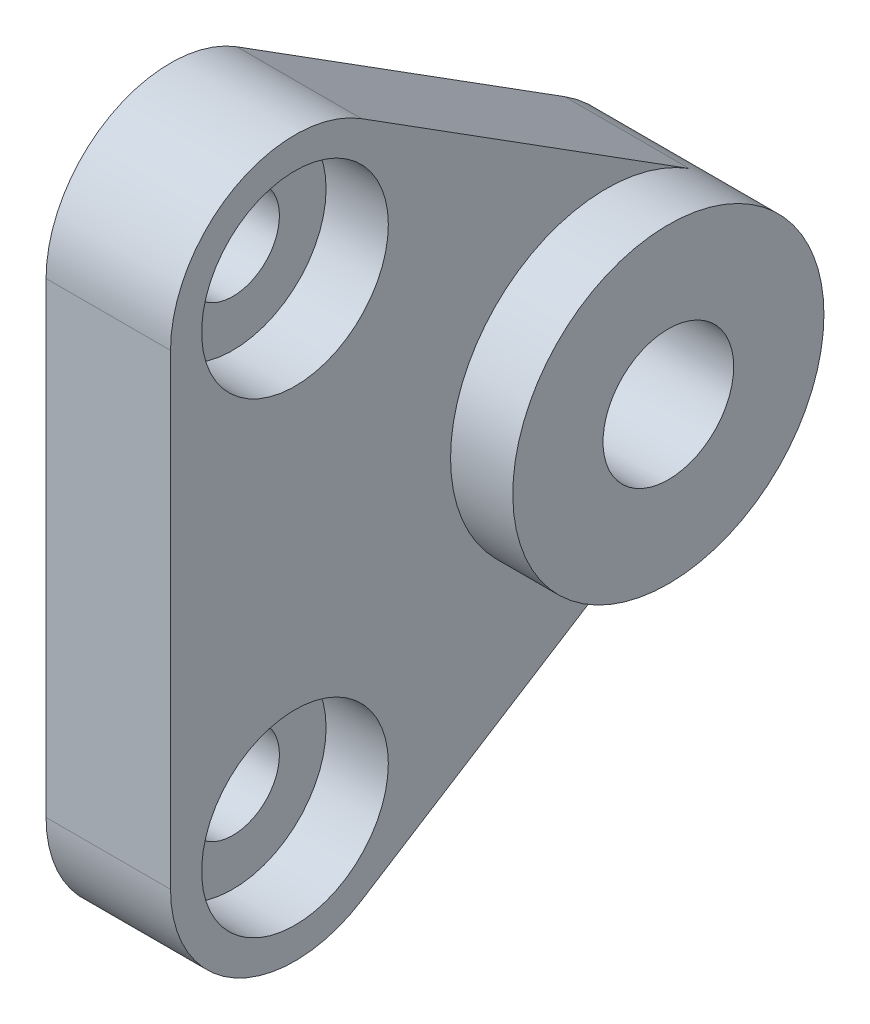
ISO-10303-21;
HEADER;
FILE_DESCRIPTION(('STEP AP214'),'2;1');
FILE_NAME('part.step','',(''),(''),'','','');
FILE_SCHEMA(('AUTOMOTIVE_DESIGN { 1 0 10303 214 1 1 1 1 }'));
ENDSEC;
DATA;
#1=APPLICATION_CONTEXT('core data for automotive mechanical design processes');
#2=APPLICATION_PROTOCOL_DEFINITION('international standard','automotive_design',2000,#1);
#3=PRODUCT_CONTEXT('',#1,'mechanical');
#4=PRODUCT('Part','Part','',(#3));
#5=PRODUCT_RELATED_PRODUCT_CATEGORY('part','',(#4));
#6=PRODUCT_DEFINITION_FORMATION('','',#4);
#7=PRODUCT_DEFINITION_CONTEXT('part definition',#1,'design');
#8=PRODUCT_DEFINITION('design','',#6,#7);
#9=PRODUCT_DEFINITION_SHAPE('','',#8);
#10=(LENGTH_UNIT() NAMED_UNIT(*) SI_UNIT(.MILLI.,.METRE.));
#11=(NAMED_UNIT(*) PLANE_ANGLE_UNIT() SI_UNIT($,.RADIAN.));
#12=(NAMED_UNIT(*) SI_UNIT($,.STERADIAN.) SOLID_ANGLE_UNIT());
#13=UNCERTAINTY_MEASURE_WITH_UNIT(LENGTH_MEASURE(1.E-05),#10,'distance_accuracy_value','');
#14=(GEOMETRIC_REPRESENTATION_CONTEXT(3) GLOBAL_UNCERTAINTY_ASSIGNED_CONTEXT((#13)) GLOBAL_UNIT_ASSIGNED_CONTEXT((#10,
#11,#12)) REPRESENTATION_CONTEXT('',''));
#15=CARTESIAN_POINT('',(0.,0.,0.));
#16=DIRECTION('',(0.,0.,1.));
#17=DIRECTION('',(1.,0.,0.));
#18=AXIS2_PLACEMENT_3D('',#15,#16,#17);
#19=CARTESIAN_POINT('',(6.,14.1031712461703,-8.90922459836754));
#20=DIRECTION('',(0.,0.845435890840135,-0.534076918130101));
#21=DIRECTION('',(0.,0.534076918130101,0.845435890840136));
#22=AXIS2_PLACEMENT_3D('',#19,#20,#21);
#23=PLANE('',#22);
#24=DIRECTION('',(-1.,0.,0.));
#25=VECTOR('',#24,1.);
#26=CARTESIAN_POINT('',(6.,18.3817435633605,-2.1363076725204));
#27=LINE('',#26,#25);
#28=CARTESIAN_POINT('',(4.,18.3817435633605,-2.1363076725204));
#29=VERTEX_POINT('',#28);
#30=CARTESIAN_POINT('',(0.,18.3817435633605,-2.1363076725204));
#31=VERTEX_POINT('',#30);
#32=EDGE_CURVE('E11',#29,#31,#27,.T.);
#33=ORIENTED_EDGE('',*,*,#32,.F.);
#34=DIRECTION('',(0.,0.534076918130101,0.845435890840136));
#35=VECTOR('',#34,1.);
#36=CARTESIAN_POINT('',(4.,14.1031712461703,-8.90922459836754));
#37=LINE('',#36,#35);
#38=CARTESIAN_POINT('',(4.,11.7271794542007,-12.6703845906505));
#39=VERTEX_POINT('',#38);
#40=EDGE_CURVE('E103',#39,#29,#37,.T.);
#41=ORIENTED_EDGE('',*,*,#40,.F.);
#42=DIRECTION('',(-1.,0.,0.));
#43=VECTOR('',#42,1.);
#44=CARTESIAN_POINT('',(6.,11.7271794542007,-12.6703845906505));
#45=LINE('',#44,#43);
#46=CARTESIAN_POINT('',(0.,11.7271794542007,-12.6703845906505));
#47=VERTEX_POINT('',#46);
#48=EDGE_CURVE('E62',#39,#47,#45,.T.);
#49=ORIENTED_EDGE('',*,*,#48,.T.);
#50=DIRECTION('',(0.,-0.534076918130101,-0.845435890840136));
#51=VECTOR('',#50,1.);
#52=CARTESIAN_POINT('',(0.,14.1031712461703,-8.90922459836754));
#53=LINE('',#52,#51);
#54=EDGE_CURVE('E135',#31,#47,#53,.T.);
#55=ORIENTED_EDGE('',*,*,#54,.F.);
#56=EDGE_LOOP('',(#33,#41,#49,#55));
#57=FACE_BOUND('',#56,.T.);
#58=ADVANCED_FACE('F46',(#57),#23,.T.);
#59=CARTESIAN_POINT('',(6.,15.,0.));
#60=DIRECTION('',(-1.,0.,0.));
#61=DIRECTION('',(0.,0.,1.));
#62=AXIS2_PLACEMENT_3D('',#59,#60,#61);
#63=CYLINDRICAL_SURFACE('',#62,4.);
#64=CARTESIAN_POINT('',(4.,15.,0.));
#65=DIRECTION('',(1.,0.,0.));
#66=DIRECTION('',(0.,0.,-1.));
#67=AXIS2_PLACEMENT_3D('',#64,#65,#66);
#68=CIRCLE('',#67,4.);
#69=CARTESIAN_POINT('',(4.,15.,4.));
#70=VERTEX_POINT('',#69);
#71=EDGE_CURVE('E109',#29,#70,#68,.T.);
#72=ORIENTED_EDGE('',*,*,#71,.F.);
#73=ORIENTED_EDGE('',*,*,#32,.T.);
#74=CARTESIAN_POINT('',(0.,15.,0.));
#75=DIRECTION('',(1.,0.,0.));
#76=DIRECTION('',(0.,0.,-1.));
#77=AXIS2_PLACEMENT_3D('',#74,#75,#76);
#78=CIRCLE('',#77,4.);
#79=CARTESIAN_POINT('',(0.,15.,4.));
#80=VERTEX_POINT('',#79);
#81=EDGE_CURVE('E150',#31,#80,#78,.T.);
#82=ORIENTED_EDGE('',*,*,#81,.T.);
#83=DIRECTION('',(-1.,0.,0.));
#84=VECTOR('',#83,1.);
#85=CARTESIAN_POINT('',(6.,15.,4.));
#86=LINE('',#85,#84);
#87=EDGE_CURVE('E54',#70,#80,#86,.T.);
#88=ORIENTED_EDGE('',*,*,#87,.F.);
#89=EDGE_LOOP('',(#72,#73,#82,#88));
#90=FACE_BOUND('',#89,.T.);
#91=ADVANCED_FACE('F189',(#90),#63,.T.);
#92=CARTESIAN_POINT('',(6.,0.,4.));
#93=DIRECTION('',(0.,0.,1.));
#94=DIRECTION('',(1.,0.,0.));
#95=AXIS2_PLACEMENT_3D('',#92,#93,#94);
#96=PLANE('',#95);
#97=DIRECTION('',(-1.,0.,0.));
#98=VECTOR('',#97,1.);
#99=CARTESIAN_POINT('',(6.,0.,4.));
#100=LINE('',#99,#98);
#101=CARTESIAN_POINT('',(4.,0.,4.));
#102=VERTEX_POINT('',#101);
#103=CARTESIAN_POINT('',(0.,0.,4.));
#104=VERTEX_POINT('',#103);
#105=EDGE_CURVE('E127',#102,#104,#100,.T.);
#106=ORIENTED_EDGE('',*,*,#105,.F.);
#107=DIRECTION('',(0.,-1.,0.));
#108=VECTOR('',#107,1.);
#109=CARTESIAN_POINT('',(4.,0.,4.));
#110=LINE('',#109,#108);
#111=EDGE_CURVE('E241',#70,#102,#110,.T.);
#112=ORIENTED_EDGE('',*,*,#111,.F.);
#113=ORIENTED_EDGE('',*,*,#87,.T.);
#114=DIRECTION('',(0.,1.,0.));
#115=VECTOR('',#114,1.);
#116=CARTESIAN_POINT('',(0.,0.,4.));
#117=LINE('',#116,#115);
#118=EDGE_CURVE('E153',#104,#80,#117,.T.);
#119=ORIENTED_EDGE('',*,*,#118,.F.);
#120=EDGE_LOOP('',(#106,#112,#113,#119));
#121=FACE_BOUND('',#120,.T.);
#122=ADVANCED_FACE('F193',(#121),#96,.T.);
#123=CARTESIAN_POINT('',(6.,0.,0.));
#124=DIRECTION('',(-1.,0.,0.));
#125=DIRECTION('',(0.,0.,1.));
#126=AXIS2_PLACEMENT_3D('',#123,#124,#125);
#127=CYLINDRICAL_SURFACE('',#126,4.);
#128=CARTESIAN_POINT('',(4.,0.,0.));
#129=DIRECTION('',(1.,0.,0.));
#130=DIRECTION('',(0.,0.,-1.));
#131=AXIS2_PLACEMENT_3D('',#128,#129,#130);
#132=CIRCLE('',#131,4.);
#133=CARTESIAN_POINT('',(4.,-3.38174356336054,-2.13630767252041));
#134=VERTEX_POINT('',#133);
#135=EDGE_CURVE('E237',#102,#134,#132,.T.);
#136=ORIENTED_EDGE('',*,*,#135,.F.);
#137=ORIENTED_EDGE('',*,*,#105,.T.);
#138=CARTESIAN_POINT('',(0.,0.,0.));
#139=DIRECTION('',(1.,0.,0.));
#140=DIRECTION('',(0.,0.,-1.));
#141=AXIS2_PLACEMENT_3D('',#138,#139,#140);
#142=CIRCLE('',#141,4.);
#143=CARTESIAN_POINT('',(0.,-3.38174356336054,-2.13630767252041));
#144=VERTEX_POINT('',#143);
#145=EDGE_CURVE('E156',#104,#144,#142,.T.);
#146=ORIENTED_EDGE('',*,*,#145,.T.);
#147=DIRECTION('',(-1.,0.,0.));
#148=VECTOR('',#147,1.);
#149=CARTESIAN_POINT('',(6.,-3.38174356336054,-2.13630767252041));
#150=LINE('',#149,#148);
#151=EDGE_CURVE('E117',#134,#144,#150,.T.);
#152=ORIENTED_EDGE('',*,*,#151,.F.);
#153=EDGE_LOOP('',(#136,#137,#146,#152));
#154=FACE_BOUND('',#153,.T.);
#155=ADVANCED_FACE('F198',(#154),#127,.T.);
#156=CARTESIAN_POINT('',(6.,-3.38174356336054,-2.13630767252041));
#157=DIRECTION('',(0.,-0.845435890840135,-0.534076918130101));
#158=DIRECTION('',(0.,0.534076918130101,-0.845435890840135));
#159=AXIS2_PLACEMENT_3D('',#156,#157,#158);
#160=PLANE('',#159);
#161=DIRECTION('',(-1.,0.,0.));
#162=VECTOR('',#161,1.);
#163=CARTESIAN_POINT('',(6.,3.27282054579932,-12.6703845906505));
#164=LINE('',#163,#162);
#165=CARTESIAN_POINT('',(4.,3.27282054579932,-12.6703845906505));
#166=VERTEX_POINT('',#165);
#167=CARTESIAN_POINT('',(0.,3.27282054579932,-12.6703845906505));
#168=VERTEX_POINT('',#167);
#169=EDGE_CURVE('E69',#166,#168,#164,.T.);
#170=ORIENTED_EDGE('',*,*,#169,.F.);
#171=DIRECTION('',(0.,0.534076918130101,-0.845435890840135));
#172=VECTOR('',#171,1.);
#173=CARTESIAN_POINT('',(4.,-3.38174356336054,-2.13630767252041));
#174=LINE('',#173,#172);
#175=EDGE_CURVE('E106',#134,#166,#174,.T.);
#176=ORIENTED_EDGE('',*,*,#175,.F.);
#177=ORIENTED_EDGE('',*,*,#151,.T.);
#178=DIRECTION('',(0.,-0.534076918130101,0.845435890840135));
#179=VECTOR('',#178,1.);
#180=CARTESIAN_POINT('',(0.,-3.38174356336054,-2.13630767252041));
#181=LINE('',#180,#179);
#182=EDGE_CURVE('E159',#168,#144,#181,.T.);
#183=ORIENTED_EDGE('',*,*,#182,.F.);
#184=EDGE_LOOP('',(#170,#176,#177,#183));
#185=FACE_BOUND('',#184,.T.);
#186=ADVANCED_FACE('F204',(#185),#160,.T.);
#187=CARTESIAN_POINT('',(6.,0.,0.));
#188=DIRECTION('',(1.,0.,0.));
#189=DIRECTION('',(0.,0.,-1.));
#190=AXIS2_PLACEMENT_3D('',#187,#188,#189);
#191=PLANE('',#190);
#192=CARTESIAN_POINT('',(6.,7.5,-10.));
#193=DIRECTION('',(1.,0.,0.));
#194=DIRECTION('',(0.,0.,-1.));
#195=AXIS2_PLACEMENT_3D('',#192,#193,#194);
#196=CIRCLE('',#195,2.1);
#197=CARTESIAN_POINT('',(6.,7.5,-12.1));
#198=VERTEX_POINT('',#197);
#199=EDGE_CURVE('E115',#198,#198,#196,.T.);
#200=ORIENTED_EDGE('',*,*,#199,.F.);
#201=EDGE_LOOP('',(#200));
#202=FACE_BOUND('',#201,.T.);
#203=CARTESIAN_POINT('',(6.,7.5,-10.));
#204=DIRECTION('',(1.,0.,0.));
#205=DIRECTION('',(0.,0.,-1.));
#206=AXIS2_PLACEMENT_3D('',#203,#204,#205);
#207=CIRCLE('',#206,5.00000000000001);
#208=CARTESIAN_POINT('',(6.,7.5,-15.));
#209=VERTEX_POINT('',#208);
#210=EDGE_CURVE('E120',#209,#209,#207,.T.);
#211=ORIENTED_EDGE('',*,*,#210,.T.);
#212=EDGE_LOOP('',(#211));
#213=FACE_BOUND('',#212,.T.);
#214=ADVANCED_FACE('F207',(#202,#213),#191,.T.);
#215=CARTESIAN_POINT('',(3.,0.,0.));
#216=DIRECTION('',(1.,0.,0.));
#217=DIRECTION('',(0.,0.,-1.));
#218=AXIS2_PLACEMENT_3D('',#215,#216,#217);
#219=CYLINDRICAL_SURFACE('',#218,3.);
#220=CARTESIAN_POINT('',(2.,0.,0.));
#221=DIRECTION('',(1.,0.,0.));
#222=DIRECTION('',(0.,0.,-1.));
#223=AXIS2_PLACEMENT_3D('',#220,#221,#222);
#224=CIRCLE('',#223,3.);
#225=CARTESIAN_POINT('',(2.,0.,-3.));
#226=VERTEX_POINT('',#225);
#227=EDGE_CURVE('E131',#226,#226,#224,.T.);
#228=ORIENTED_EDGE('',*,*,#227,.F.);
#229=EDGE_LOOP('',(#228));
#230=FACE_BOUND('',#229,.T.);
#231=CARTESIAN_POINT('',(4.,0.,0.));
#232=DIRECTION('',(1.,0.,0.));
#233=DIRECTION('',(0.,0.,-1.));
#234=AXIS2_PLACEMENT_3D('',#231,#232,#233);
#235=CIRCLE('',#234,3.);
#236=CARTESIAN_POINT('',(4.,0.,-3.));
#237=VERTEX_POINT('',#236);
#238=EDGE_CURVE('E234',#237,#237,#235,.F.);
#239=ORIENTED_EDGE('',*,*,#238,.F.);
#240=EDGE_LOOP('',(#239));
#241=FACE_BOUND('',#240,.T.);
#242=ADVANCED_FACE('F219',(#230,#241),#219,.F.);
#243=CARTESIAN_POINT('',(3.,15.,0.));
#244=DIRECTION('',(1.,0.,0.));
#245=DIRECTION('',(0.,0.,-1.));
#246=AXIS2_PLACEMENT_3D('',#243,#244,#245);
#247=CYLINDRICAL_SURFACE('',#246,3.);
#248=CARTESIAN_POINT('',(2.,15.,0.));
#249=DIRECTION('',(1.,0.,0.));
#250=DIRECTION('',(0.,0.,-1.));
#251=AXIS2_PLACEMENT_3D('',#248,#249,#250);
#252=CIRCLE('',#251,3.);
#253=CARTESIAN_POINT('',(2.,15.,-3.));
#254=VERTEX_POINT('',#253);
#255=EDGE_CURVE('E137',#254,#254,#252,.T.);
#256=ORIENTED_EDGE('',*,*,#255,.F.);
#257=EDGE_LOOP('',(#256));
#258=FACE_BOUND('',#257,.T.);
#259=CARTESIAN_POINT('',(4.,15.,0.));
#260=DIRECTION('',(1.,0.,0.));
#261=DIRECTION('',(0.,0.,-1.));
#262=AXIS2_PLACEMENT_3D('',#259,#260,#261);
#263=CIRCLE('',#262,3.);
#264=CARTESIAN_POINT('',(4.,15.,-3.));
#265=VERTEX_POINT('',#264);
#266=EDGE_CURVE('E142',#265,#265,#263,.F.);
#267=ORIENTED_EDGE('',*,*,#266,.F.);
#268=EDGE_LOOP('',(#267));
#269=FACE_BOUND('',#268,.T.);
#270=ADVANCED_FACE('F214',(#258,#269),#247,.F.);
#271=CARTESIAN_POINT('',(6.,15.,0.));
#272=DIRECTION('',(-1.,0.,0.));
#273=DIRECTION('',(0.,0.,1.));
#274=AXIS2_PLACEMENT_3D('',#271,#272,#273);
#275=CYLINDRICAL_SURFACE('',#274,1.5);
#276=CARTESIAN_POINT('',(0.,15.,0.));
#277=DIRECTION('',(1.,0.,0.));
#278=DIRECTION('',(0.,0.,-1.));
#279=AXIS2_PLACEMENT_3D('',#276,#277,#278);
#280=CIRCLE('',#279,1.5);
#281=CARTESIAN_POINT('',(0.,15.,-1.5));
#282=VERTEX_POINT('',#281);
#283=EDGE_CURVE('E165',#282,#282,#280,.T.);
#284=ORIENTED_EDGE('',*,*,#283,.F.);
#285=EDGE_LOOP('',(#284));
#286=FACE_BOUND('',#285,.T.);
#287=CARTESIAN_POINT('',(2.,15.,0.));
#288=DIRECTION('',(1.,0.,0.));
#289=DIRECTION('',(0.,0.,-1.));
#290=AXIS2_PLACEMENT_3D('',#287,#288,#289);
#291=CIRCLE('',#290,1.5);
#292=CARTESIAN_POINT('',(2.,15.,-1.5));
#293=VERTEX_POINT('',#292);
#294=EDGE_CURVE('E49',#293,#293,#291,.T.);
#295=ORIENTED_EDGE('',*,*,#294,.T.);
#296=EDGE_LOOP('',(#295));
#297=FACE_BOUND('',#296,.T.);
#298=ADVANCED_FACE('F211',(#286,#297),#275,.F.);
#299=CARTESIAN_POINT('',(6.,0.,0.));
#300=DIRECTION('',(-1.,0.,0.));
#301=DIRECTION('',(0.,0.,1.));
#302=AXIS2_PLACEMENT_3D('',#299,#300,#301);
#303=CYLINDRICAL_SURFACE('',#302,1.5);
#304=CARTESIAN_POINT('',(0.,0.,0.));
#305=DIRECTION('',(1.,0.,0.));
#306=DIRECTION('',(0.,0.,-1.));
#307=AXIS2_PLACEMENT_3D('',#304,#305,#306);
#308=CIRCLE('',#307,1.5);
#309=CARTESIAN_POINT('',(0.,0.,-1.5));
#310=VERTEX_POINT('',#309);
#311=EDGE_CURVE('E163',#310,#310,#308,.T.);
#312=ORIENTED_EDGE('',*,*,#311,.F.);
#313=EDGE_LOOP('',(#312));
#314=FACE_BOUND('',#313,.T.);
#315=CARTESIAN_POINT('',(2.,0.,0.));
#316=DIRECTION('',(1.,0.,0.));
#317=DIRECTION('',(0.,0.,-1.));
#318=AXIS2_PLACEMENT_3D('',#315,#316,#317);
#319=CIRCLE('',#318,1.5);
#320=CARTESIAN_POINT('',(2.,0.,-1.5));
#321=VERTEX_POINT('',#320);
#322=EDGE_CURVE('E129',#321,#321,#319,.T.);
#323=ORIENTED_EDGE('',*,*,#322,.T.);
#324=EDGE_LOOP('',(#323));
#325=FACE_BOUND('',#324,.T.);
#326=ADVANCED_FACE('F185',(#314,#325),#303,.F.);
#327=CARTESIAN_POINT('',(6.,7.5,-10.));
#328=DIRECTION('',(-1.,0.,0.));
#329=DIRECTION('',(0.,0.,1.));
#330=AXIS2_PLACEMENT_3D('',#327,#328,#329);
#331=CYLINDRICAL_SURFACE('',#330,5.00000000000001);
#332=CARTESIAN_POINT('',(4.,7.5,-10.));
#333=DIRECTION('',(1.,0.,0.));
#334=DIRECTION('',(0.,0.,-1.));
#335=AXIS2_PLACEMENT_3D('',#332,#333,#334);
#336=CIRCLE('',#335,5.);
#337=EDGE_CURVE('E100',#39,#166,#336,.T.);
#338=ORIENTED_EDGE('',*,*,#337,.T.);
#339=ORIENTED_EDGE('',*,*,#169,.T.);
#340=CARTESIAN_POINT('',(0.,7.5,-10.));
#341=DIRECTION('',(1.,0.,0.));
#342=DIRECTION('',(0.,0.,-1.));
#343=AXIS2_PLACEMENT_3D('',#340,#341,#342);
#344=CIRCLE('',#343,5.00000000000001);
#345=EDGE_CURVE('E113',#168,#47,#344,.T.);
#346=ORIENTED_EDGE('',*,*,#345,.T.);
#347=ORIENTED_EDGE('',*,*,#48,.F.);
#348=EDGE_LOOP('',(#338,#339,#346,#347));
#349=FACE_BOUND('',#348,.T.);
#350=ORIENTED_EDGE('',*,*,#210,.F.);
#351=EDGE_LOOP('',(#350));
#352=FACE_BOUND('',#351,.T.);
#353=ADVANCED_FACE('F111',(#349,#352),#331,.T.);
#354=CARTESIAN_POINT('',(6.,7.5,-10.));
#355=DIRECTION('',(-1.,0.,0.));
#356=DIRECTION('',(0.,0.,1.));
#357=AXIS2_PLACEMENT_3D('',#354,#355,#356);
#358=CYLINDRICAL_SURFACE('',#357,2.1);
#359=ORIENTED_EDGE('',*,*,#199,.T.);
#360=EDGE_LOOP('',(#359));
#361=FACE_BOUND('',#360,.T.);
#362=CARTESIAN_POINT('',(0.,7.5,-10.));
#363=DIRECTION('',(1.,0.,0.));
#364=DIRECTION('',(0.,0.,-1.));
#365=AXIS2_PLACEMENT_3D('',#362,#363,#364);
#366=CIRCLE('',#365,2.1);
#367=CARTESIAN_POINT('',(0.,7.5,-12.1));
#368=VERTEX_POINT('',#367);
#369=EDGE_CURVE('E123',#368,#368,#366,.T.);
#370=ORIENTED_EDGE('',*,*,#369,.F.);
#371=EDGE_LOOP('',(#370));
#372=FACE_BOUND('',#371,.T.);
#373=ADVANCED_FACE('F174',(#361,#372),#358,.F.);
#374=CARTESIAN_POINT('',(0.,0.,0.));
#375=DIRECTION('',(1.,0.,0.));
#376=DIRECTION('',(0.,0.,-1.));
#377=AXIS2_PLACEMENT_3D('',#374,#375,#376);
#378=PLANE('',#377);
#379=ORIENTED_EDGE('',*,*,#54,.T.);
#380=ORIENTED_EDGE('',*,*,#345,.F.);
#381=ORIENTED_EDGE('',*,*,#182,.T.);
#382=ORIENTED_EDGE('',*,*,#145,.F.);
#383=ORIENTED_EDGE('',*,*,#118,.T.);
#384=ORIENTED_EDGE('',*,*,#81,.F.);
#385=EDGE_LOOP('',(#379,#380,#381,#382,#383,#384));
#386=FACE_BOUND('',#385,.T.);
#387=ORIENTED_EDGE('',*,*,#311,.T.);
#388=EDGE_LOOP('',(#387));
#389=FACE_BOUND('',#388,.T.);
#390=ORIENTED_EDGE('',*,*,#283,.T.);
#391=EDGE_LOOP('',(#390));
#392=FACE_BOUND('',#391,.T.);
#393=ORIENTED_EDGE('',*,*,#369,.T.);
#394=EDGE_LOOP('',(#393));
#395=FACE_BOUND('',#394,.T.);
#396=ADVANCED_FACE('F172',(#386,#389,#392,#395),#378,.F.);
#397=CARTESIAN_POINT('',(2.,15.,0.));
#398=DIRECTION('',(1.,0.,0.));
#399=DIRECTION('',(0.,0.,-1.));
#400=AXIS2_PLACEMENT_3D('',#397,#398,#399);
#401=PLANE('',#400);
#402=ORIENTED_EDGE('',*,*,#294,.F.);
#403=EDGE_LOOP('',(#402));
#404=FACE_BOUND('',#403,.T.);
#405=ORIENTED_EDGE('',*,*,#255,.T.);
#406=EDGE_LOOP('',(#405));
#407=FACE_BOUND('',#406,.T.);
#408=ADVANCED_FACE('F182',(#404,#407),#401,.T.);
#409=CARTESIAN_POINT('',(2.,0.,0.));
#410=DIRECTION('',(1.,0.,0.));
#411=DIRECTION('',(0.,0.,-1.));
#412=AXIS2_PLACEMENT_3D('',#409,#410,#411);
#413=PLANE('',#412);
#414=ORIENTED_EDGE('',*,*,#322,.F.);
#415=EDGE_LOOP('',(#414));
#416=FACE_BOUND('',#415,.T.);
#417=ORIENTED_EDGE('',*,*,#227,.T.);
#418=EDGE_LOOP('',(#417));
#419=FACE_BOUND('',#418,.T.);
#420=ADVANCED_FACE('F227',(#416,#419),#413,.T.);
#421=CARTESIAN_POINT('',(4.,0.,0.));
#422=DIRECTION('',(1.,0.,0.));
#423=DIRECTION('',(0.,0.,-1.));
#424=AXIS2_PLACEMENT_3D('',#421,#422,#423);
#425=PLANE('',#424);
#426=ORIENTED_EDGE('',*,*,#337,.F.);
#427=ORIENTED_EDGE('',*,*,#40,.T.);
#428=ORIENTED_EDGE('',*,*,#71,.T.);
#429=ORIENTED_EDGE('',*,*,#111,.T.);
#430=ORIENTED_EDGE('',*,*,#135,.T.);
#431=ORIENTED_EDGE('',*,*,#175,.T.);
#432=EDGE_LOOP('',(#426,#427,#428,#429,#430,#431));
#433=FACE_BOUND('',#432,.T.);
#434=ORIENTED_EDGE('',*,*,#238,.T.);
#435=EDGE_LOOP('',(#434));
#436=FACE_BOUND('',#435,.T.);
#437=ORIENTED_EDGE('',*,*,#266,.T.);
#438=EDGE_LOOP('',(#437));
#439=FACE_BOUND('',#438,.T.);
#440=ADVANCED_FACE('F101',(#433,#436,#439),#425,.T.);
#441=CLOSED_SHELL('',(#58,#91,#122,#155,#186,#214,#242,#270,#298,#326,#353,#373,#396,#408,#420,#440));
#442=MANIFOLD_SOLID_BREP('B2',#441);
#443=ADVANCED_BREP_SHAPE_REPRESENTATION('',(#18,#442),#14);
#444=SHAPE_DEFINITION_REPRESENTATION(#9,#443);
ENDSEC;
END-ISO-10303-21;
